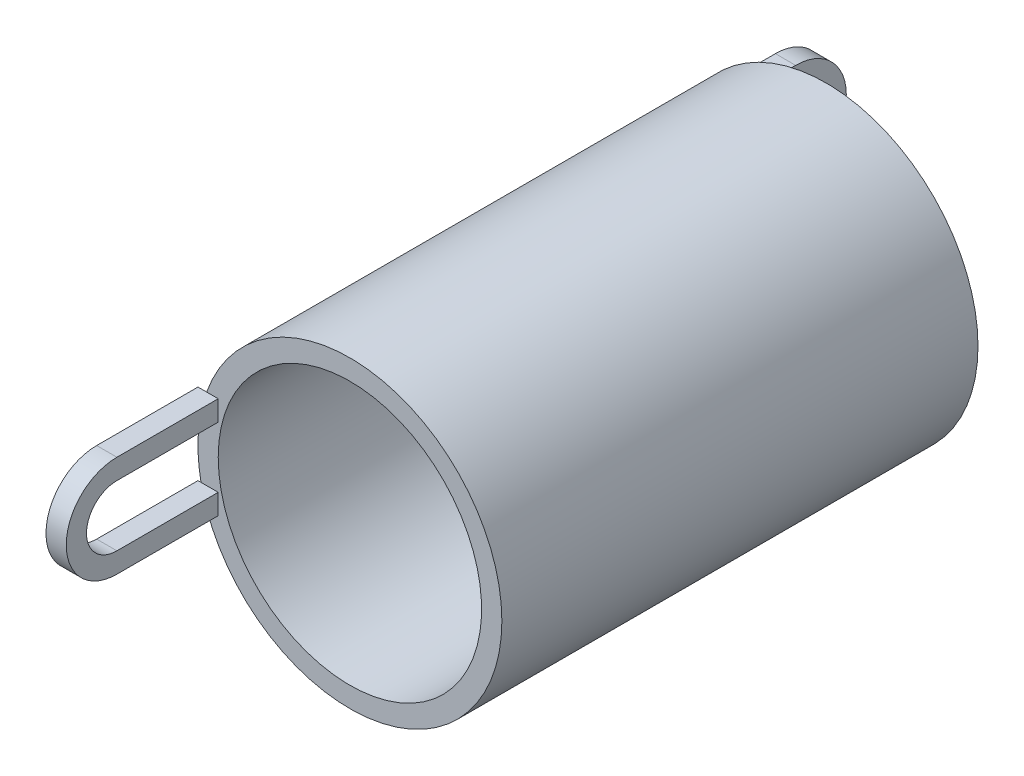
ISO-10303-21;
HEADER;
FILE_DESCRIPTION(('STEP AP214'),'2;1');
FILE_NAME('part.step','',(''),(''),'','','');
FILE_SCHEMA(('AUTOMOTIVE_DESIGN { 1 0 10303 214 1 1 1 1 }'));
ENDSEC;
DATA;
#1=APPLICATION_CONTEXT('core data for automotive mechanical design processes');
#2=APPLICATION_PROTOCOL_DEFINITION('international standard','automotive_design',2000,#1);
#3=PRODUCT_CONTEXT('',#1,'mechanical');
#4=PRODUCT('Part','Part','',(#3));
#5=PRODUCT_RELATED_PRODUCT_CATEGORY('part','',(#4));
#6=PRODUCT_DEFINITION_FORMATION('','',#4);
#7=PRODUCT_DEFINITION_CONTEXT('part definition',#1,'design');
#8=PRODUCT_DEFINITION('design','',#6,#7);
#9=PRODUCT_DEFINITION_SHAPE('','',#8);
#10=(LENGTH_UNIT() NAMED_UNIT(*) SI_UNIT(.MILLI.,.METRE.));
#11=(NAMED_UNIT(*) PLANE_ANGLE_UNIT() SI_UNIT($,.RADIAN.));
#12=(NAMED_UNIT(*) SI_UNIT($,.STERADIAN.) SOLID_ANGLE_UNIT());
#13=UNCERTAINTY_MEASURE_WITH_UNIT(LENGTH_MEASURE(1.E-05),#10,'distance_accuracy_value','');
#14=(GEOMETRIC_REPRESENTATION_CONTEXT(3) GLOBAL_UNCERTAINTY_ASSIGNED_CONTEXT((#13)) GLOBAL_UNIT_ASSIGNED_CONTEXT((#10,
#11,#12)) REPRESENTATION_CONTEXT('',''));
#15=CARTESIAN_POINT('',(0.,0.,0.));
#16=DIRECTION('',(0.,0.,1.));
#17=DIRECTION('',(1.,0.,0.));
#18=AXIS2_PLACEMENT_3D('',#15,#16,#17);
#19=CARTESIAN_POINT('',(-1.66533453693773E-13,0.,23.5));
#20=DIRECTION('',(0.,0.,0.999999999999999));
#21=DIRECTION('',(1.,0.,0.));
#22=AXIS2_PLACEMENT_3D('',#19,#20,#21);
#23=PLANE('',#22);
#24=CARTESIAN_POINT('',(-1.66533453693773E-13,0.,23.5));
#25=DIRECTION('',(0.,0.,0.999999999999999));
#26=DIRECTION('',(1.,0.,0.));
#27=AXIS2_PLACEMENT_3D('',#24,#25,#26);
#28=CIRCLE('',#27,6.5);
#29=CARTESIAN_POINT('',(-6.50000000000017,0.,23.5));
#30=VERTEX_POINT('',#29);
#31=EDGE_CURVE('E305',#30,#30,#28,.T.);
#32=ORIENTED_EDGE('',*,*,#31,.F.);
#33=EDGE_LOOP('',(#32));
#34=FACE_BOUND('',#33,.T.);
#35=DIRECTION('',(0.,0.999999999999999,0.));
#36=VECTOR('',#35,1.);
#37=CARTESIAN_POINT('',(-6.50000000000006,1.50000000000003,23.5));
#38=LINE('',#37,#36);
#39=CARTESIAN_POINT('',(-6.50000000000006,1.50000000000003,23.5));
#40=VERTEX_POINT('',#39);
#41=CARTESIAN_POINT('',(-6.50000000000009,2.50000000000001,23.5));
#42=VERTEX_POINT('',#41);
#43=EDGE_CURVE('E57',#40,#42,#38,.T.);
#44=ORIENTED_EDGE('',*,*,#43,.F.);
#45=DIRECTION('',(-1.,0.,0.));
#46=VECTOR('',#45,1.);
#47=CARTESIAN_POINT('',(-6.50000000000006,1.50000000000003,23.5));
#48=LINE('',#47,#46);
#49=CARTESIAN_POINT('',(-7.34846922834961,1.50000000000002,23.5));
#50=VERTEX_POINT('',#49);
#51=EDGE_CURVE('E581',#40,#50,#48,.T.);
#52=ORIENTED_EDGE('',*,*,#51,.T.);
#53=CARTESIAN_POINT('',(-1.66533453693773E-13,0.,23.5));
#54=DIRECTION('',(0.,0.,0.999999999999999));
#55=DIRECTION('',(1.,0.,0.));
#56=AXIS2_PLACEMENT_3D('',#53,#54,#55);
#57=CIRCLE('',#56,7.5);
#58=CARTESIAN_POINT('',(-7.34846922834961,-1.49999999999999,23.5));
#59=VERTEX_POINT('',#58);
#60=EDGE_CURVE('E49',#50,#59,#57,.T.);
#61=ORIENTED_EDGE('',*,*,#60,.T.);
#62=DIRECTION('',(-1.,0.,0.));
#63=VECTOR('',#62,1.);
#64=CARTESIAN_POINT('',(-6.50000000000006,-1.49999999999998,23.5));
#65=LINE('',#64,#63);
#66=CARTESIAN_POINT('',(-6.50000000000006,-1.49999999999998,23.5));
#67=VERTEX_POINT('',#66);
#68=EDGE_CURVE('E592',#67,#59,#65,.T.);
#69=ORIENTED_EDGE('',*,*,#68,.F.);
#70=DIRECTION('',(0.,0.999999999999999,0.));
#71=VECTOR('',#70,1.);
#72=CARTESIAN_POINT('',(-6.50000000000006,-2.49999999999998,23.5));
#73=LINE('',#72,#71);
#74=CARTESIAN_POINT('',(-6.50000000000006,-2.49999999999998,23.5));
#75=VERTEX_POINT('',#74);
#76=EDGE_CURVE('E192',#75,#67,#73,.T.);
#77=ORIENTED_EDGE('',*,*,#76,.F.);
#78=DIRECTION('',(-1.,0.,0.));
#79=VECTOR('',#78,1.);
#80=CARTESIAN_POINT('',(-6.50000000000006,-2.49999999999998,23.5));
#81=LINE('',#80,#79);
#82=CARTESIAN_POINT('',(-7.07106781186553,-2.49999999999998,23.5));
#83=VERTEX_POINT('',#82);
#84=EDGE_CURVE('E188',#75,#83,#81,.T.);
#85=ORIENTED_EDGE('',*,*,#84,.T.);
#86=CARTESIAN_POINT('',(-7.07106781186556,2.50000000000002,23.5));
#87=VERTEX_POINT('',#86);
#88=EDGE_CURVE('E50',#83,#87,#57,.T.);
#89=ORIENTED_EDGE('',*,*,#88,.T.);
#90=DIRECTION('',(-1.,0.,0.));
#91=VECTOR('',#90,1.);
#92=CARTESIAN_POINT('',(-6.50000000000009,2.50000000000001,23.5));
#93=LINE('',#92,#91);
#94=EDGE_CURVE('E62',#42,#87,#93,.T.);
#95=ORIENTED_EDGE('',*,*,#94,.F.);
#96=EDGE_LOOP('',(#44,#52,#61,#69,#77,#85,#89,#95));
#97=FACE_BOUND('',#96,.T.);
#98=ADVANCED_FACE('F39',(#34,#97),#23,.T.);
#99=CARTESIAN_POINT('',(0.,0.,0.));
#100=DIRECTION('',(0.,0.,0.999999999999999));
#101=DIRECTION('',(1.,0.,0.));
#102=AXIS2_PLACEMENT_3D('',#99,#100,#101);
#103=PLANE('',#102);
#104=CARTESIAN_POINT('',(0.,0.,0.));
#105=DIRECTION('',(0.,0.,0.999999999999999));
#106=DIRECTION('',(1.,0.,0.));
#107=AXIS2_PLACEMENT_3D('',#104,#105,#106);
#108=CIRCLE('',#107,6.5);
#109=CARTESIAN_POINT('',(-6.50000000000017,0.,0.));
#110=VERTEX_POINT('',#109);
#111=EDGE_CURVE('E304',#110,#110,#108,.T.);
#112=ORIENTED_EDGE('',*,*,#111,.T.);
#113=EDGE_LOOP('',(#112));
#114=FACE_BOUND('',#113,.T.);
#115=DIRECTION('',(-1.,0.,0.));
#116=VECTOR('',#115,1.);
#117=CARTESIAN_POINT('',(-6.50000000000009,-1.5,0.));
#118=LINE('',#117,#116);
#119=CARTESIAN_POINT('',(-6.50000000000009,-1.5,0.));
#120=VERTEX_POINT('',#119);
#121=CARTESIAN_POINT('',(-7.34846922834961,-1.5,0.));
#122=VERTEX_POINT('',#121);
#123=EDGE_CURVE('E296',#120,#122,#118,.T.);
#124=ORIENTED_EDGE('',*,*,#123,.T.);
#125=CARTESIAN_POINT('',(0.,0.,0.));
#126=DIRECTION('',(0.,0.,0.999999999999999));
#127=DIRECTION('',(1.,0.,0.));
#128=AXIS2_PLACEMENT_3D('',#125,#126,#127);
#129=CIRCLE('',#128,7.5);
#130=CARTESIAN_POINT('',(-7.34846922834961,1.50000000000001,0.));
#131=VERTEX_POINT('',#130);
#132=EDGE_CURVE('E636',#131,#122,#129,.T.);
#133=ORIENTED_EDGE('',*,*,#132,.F.);
#134=DIRECTION('',(-1.,0.,0.));
#135=VECTOR('',#134,1.);
#136=CARTESIAN_POINT('',(-6.50000000000009,1.50000000000001,0.));
#137=LINE('',#136,#135);
#138=CARTESIAN_POINT('',(-6.50000000000009,1.50000000000001,0.));
#139=VERTEX_POINT('',#138);
#140=EDGE_CURVE('E275',#139,#131,#137,.T.);
#141=ORIENTED_EDGE('',*,*,#140,.F.);
#142=DIRECTION('',(0.,-1.,0.));
#143=VECTOR('',#142,1.);
#144=CARTESIAN_POINT('',(-6.50000000000009,2.50000000000003,0.));
#145=LINE('',#144,#143);
#146=CARTESIAN_POINT('',(-6.50000000000009,2.50000000000003,0.));
#147=VERTEX_POINT('',#146);
#148=EDGE_CURVE('E241',#147,#139,#145,.T.);
#149=ORIENTED_EDGE('',*,*,#148,.F.);
#150=DIRECTION('',(-1.,0.,0.));
#151=VECTOR('',#150,1.);
#152=CARTESIAN_POINT('',(-6.50000000000009,2.50000000000003,0.));
#153=LINE('',#152,#151);
#154=CARTESIAN_POINT('',(-7.07106781186556,2.50000000000003,0.));
#155=VERTEX_POINT('',#154);
#156=EDGE_CURVE('E279',#147,#155,#153,.T.);
#157=ORIENTED_EDGE('',*,*,#156,.T.);
#158=CARTESIAN_POINT('',(-7.07106781186556,-2.5,0.));
#159=VERTEX_POINT('',#158);
#160=EDGE_CURVE('E309',#159,#155,#129,.T.);
#161=ORIENTED_EDGE('',*,*,#160,.F.);
#162=DIRECTION('',(-1.,0.,0.));
#163=VECTOR('',#162,1.);
#164=CARTESIAN_POINT('',(-6.50000000000009,-2.5,0.));
#165=LINE('',#164,#163);
#166=CARTESIAN_POINT('',(-6.50000000000009,-2.5,0.));
#167=VERTEX_POINT('',#166);
#168=EDGE_CURVE('E292',#167,#159,#165,.T.);
#169=ORIENTED_EDGE('',*,*,#168,.F.);
#170=DIRECTION('',(0.,-0.999999999999999,0.));
#171=VECTOR('',#170,1.);
#172=CARTESIAN_POINT('',(-6.50000000000009,-2.5,0.));
#173=LINE('',#172,#171);
#174=EDGE_CURVE('E229',#120,#167,#173,.T.);
#175=ORIENTED_EDGE('',*,*,#174,.F.);
#176=EDGE_LOOP('',(#124,#133,#141,#149,#157,#161,#169,#175));
#177=FACE_BOUND('',#176,.T.);
#178=ADVANCED_FACE('F315',(#114,#177),#103,.F.);
#179=CARTESIAN_POINT('',(-1.66533453693773E-13,0.,23.5));
#180=DIRECTION('',(0.,0.,-0.999999999999999));
#181=DIRECTION('',(-1.,0.,0.));
#182=AXIS2_PLACEMENT_3D('',#179,#180,#181);
#183=CYLINDRICAL_SURFACE('',#182,7.5);
#184=EDGE_CURVE('E11',#87,#50,#57,.T.);
#185=ORIENTED_EDGE('',*,*,#184,.F.);
#186=ORIENTED_EDGE('',*,*,#88,.F.);
#187=EDGE_CURVE('E628',#59,#83,#57,.T.);
#188=ORIENTED_EDGE('',*,*,#187,.F.);
#189=ORIENTED_EDGE('',*,*,#60,.F.);
#190=EDGE_LOOP('',(#185,#186,#188,#189));
#191=FACE_BOUND('',#190,.T.);
#192=EDGE_CURVE('E43',#155,#131,#129,.T.);
#193=ORIENTED_EDGE('',*,*,#192,.T.);
#194=ORIENTED_EDGE('',*,*,#132,.T.);
#195=EDGE_CURVE('E642',#122,#159,#129,.T.);
#196=ORIENTED_EDGE('',*,*,#195,.T.);
#197=ORIENTED_EDGE('',*,*,#160,.T.);
#198=EDGE_LOOP('',(#193,#194,#196,#197));
#199=FACE_BOUND('',#198,.T.);
#200=ADVANCED_FACE('F41',(#191,#199),#183,.T.);
#201=CARTESIAN_POINT('',(-1.66533453693773E-13,0.,23.5));
#202=DIRECTION('',(0.,0.,-0.999999999999999));
#203=DIRECTION('',(-1.,0.,0.));
#204=AXIS2_PLACEMENT_3D('',#201,#202,#203);
#205=CYLINDRICAL_SURFACE('',#204,6.5);
#206=CARTESIAN_POINT('',(-6.50000000000017,0.,23.5));
#207=CARTESIAN_POINT('',(-6.50000000000017,0.,23.2552083333333));
#208=CARTESIAN_POINT('',(-6.50000000000017,0.,23.0104166666666));
#209=CARTESIAN_POINT('',(-6.50000000000017,0.,22.5208333333333));
#210=CARTESIAN_POINT('',(-6.50000000000017,0.,22.2760416666666));
#211=CARTESIAN_POINT('',(-6.50000000000017,0.,21.7864583333333));
#212=CARTESIAN_POINT('',(-6.50000000000017,0.,21.5416666666666));
#213=CARTESIAN_POINT('',(-6.50000000000017,0.,21.0520833333333));
#214=CARTESIAN_POINT('',(-6.50000000000017,0.,20.8072916666666));
#215=CARTESIAN_POINT('',(-6.50000000000017,0.,20.3177083333333));
#216=CARTESIAN_POINT('',(-6.50000000000017,0.,20.0729166666666));
#217=CARTESIAN_POINT('',(-6.50000000000017,0.,19.5833333333333));
#218=CARTESIAN_POINT('',(-6.50000000000017,0.,19.3385416666666));
#219=CARTESIAN_POINT('',(-6.50000000000017,0.,18.8489583333333));
#220=CARTESIAN_POINT('',(-6.50000000000017,0.,18.6041666666666));
#221=CARTESIAN_POINT('',(-6.50000000000017,0.,18.1145833333333));
#222=CARTESIAN_POINT('',(-6.50000000000017,0.,17.8697916666667));
#223=CARTESIAN_POINT('',(-6.50000000000017,0.,17.3802083333333));
#224=CARTESIAN_POINT('',(-6.50000000000017,0.,17.1354166666666));
#225=CARTESIAN_POINT('',(-6.50000000000017,0.,16.6458333333333));
#226=CARTESIAN_POINT('',(-6.50000000000017,0.,16.4010416666666));
#227=CARTESIAN_POINT('',(-6.50000000000017,0.,15.9114583333333));
#228=CARTESIAN_POINT('',(-6.50000000000017,0.,15.6666666666666));
#229=CARTESIAN_POINT('',(-6.50000000000017,0.,15.1770833333333));
#230=CARTESIAN_POINT('',(-6.50000000000017,0.,14.9322916666667));
#231=CARTESIAN_POINT('',(-6.50000000000017,0.,14.4427083333333));
#232=CARTESIAN_POINT('',(-6.50000000000017,0.,14.1979166666667));
#233=CARTESIAN_POINT('',(-6.50000000000017,0.,13.7083333333333));
#234=CARTESIAN_POINT('',(-6.50000000000017,0.,13.4635416666667));
#235=CARTESIAN_POINT('',(-6.50000000000017,0.,12.9739583333333));
#236=CARTESIAN_POINT('',(-6.50000000000017,0.,12.7291666666667));
#237=CARTESIAN_POINT('',(-6.50000000000017,0.,12.2395833333333));
#238=CARTESIAN_POINT('',(-6.50000000000017,0.,11.9947916666667));
#239=CARTESIAN_POINT('',(-6.50000000000017,0.,11.5052083333333));
#240=CARTESIAN_POINT('',(-6.50000000000017,0.,11.2604166666667));
#241=CARTESIAN_POINT('',(-6.50000000000017,0.,10.7708333333333));
#242=CARTESIAN_POINT('',(-6.50000000000017,0.,10.5260416666667));
#243=CARTESIAN_POINT('',(-6.50000000000017,0.,10.0364583333333));
#244=CARTESIAN_POINT('',(-6.50000000000017,0.,9.79166666666665));
#245=CARTESIAN_POINT('',(-6.50000000000017,0.,9.30208333333332));
#246=CARTESIAN_POINT('',(-6.50000000000017,0.,9.05729166666665));
#247=CARTESIAN_POINT('',(-6.50000000000017,0.,8.56770833333332));
#248=CARTESIAN_POINT('',(-6.50000000000017,0.,8.32291666666666));
#249=CARTESIAN_POINT('',(-6.50000000000017,0.,7.83333333333332));
#250=CARTESIAN_POINT('',(-6.50000000000017,0.,7.58854166666666));
#251=CARTESIAN_POINT('',(-6.50000000000017,0.,7.09895833333333));
#252=CARTESIAN_POINT('',(-6.50000000000017,0.,6.85416666666666));
#253=CARTESIAN_POINT('',(-6.50000000000017,0.,6.36458333333333));
#254=CARTESIAN_POINT('',(-6.50000000000017,0.,6.11979166666666));
#255=CARTESIAN_POINT('',(-6.50000000000017,0.,5.63020833333333));
#256=CARTESIAN_POINT('',(-6.50000000000017,0.,5.38541666666666));
#257=CARTESIAN_POINT('',(-6.50000000000017,0.,4.89583333333333));
#258=CARTESIAN_POINT('',(-6.50000000000017,0.,4.65104166666666));
#259=CARTESIAN_POINT('',(-6.50000000000017,0.,4.16145833333333));
#260=CARTESIAN_POINT('',(-6.50000000000017,0.,3.91666666666666));
#261=CARTESIAN_POINT('',(-6.50000000000017,0.,3.42708333333333));
#262=CARTESIAN_POINT('',(-6.50000000000017,0.,3.18229166666666));
#263=CARTESIAN_POINT('',(-6.50000000000017,0.,2.69270833333333));
#264=CARTESIAN_POINT('',(-6.50000000000017,0.,2.44791666666666));
#265=CARTESIAN_POINT('',(-6.50000000000017,0.,1.95833333333333));
#266=CARTESIAN_POINT('',(-6.50000000000017,0.,1.71354166666666));
#267=CARTESIAN_POINT('',(-6.50000000000017,0.,1.22395833333333));
#268=CARTESIAN_POINT('',(-6.50000000000017,0.,0.979166666666665));
#269=CARTESIAN_POINT('',(-6.50000000000017,0.,0.489583333333333));
#270=CARTESIAN_POINT('',(-6.50000000000017,0.,0.244791666666666));
#271=CARTESIAN_POINT('',(-6.50000000000017,0.,0.));
#272=B_SPLINE_CURVE_WITH_KNOTS('',3,(#206,#207,#208,#209,#210,#211,#212,#213,#214,#215,#216,
#217,#218,#219,#220,#221,#222,#223,#224,#225,#226,#227,#228,#229,#230,#231,#232,#233,#234,#235,
#236,#237,#238,#239,#240,#241,#242,#243,#244,#245,#246,#247,#248,#249,#250,#251,#252,#253,#254,
#255,#256,#257,#258,#259,#260,#261,#262,#263,#264,#265,#266,#267,#268,#269,#270,#271),
.UNSPECIFIED.,.F.,.F.,(4,2,2,2,2,2,2,2,2,2,2,2,2,2,2,2,2,2,2,2,2,2,2,2,2,2,2,2,2,2,2,2,4),(0.,
0.734375000000002,1.46875,2.203125,2.9375,3.671875,4.40625,5.140625,5.87499999999999,6.609375,
7.34374999999999,8.07812499999999,8.81249999999999,9.54687499999999,10.28125,11.015625,11.75,
12.484375,13.21875,13.953125,14.6875,15.421875,16.15625,16.890625,17.625,18.359375,19.09375,
19.828125,20.5625,21.296875,22.03125,22.765625,23.5),.UNSPECIFIED.);
#273=EDGE_CURVE('BSEAM318',#30,#110,#272,.T.);
#274=ORIENTED_EDGE('',*,*,#31,.T.);
#275=ORIENTED_EDGE('',*,*,#111,.F.);
#276=ORIENTED_EDGE('',*,*,#273,.T.);
#277=ORIENTED_EDGE('',*,*,#273,.F.);
#278=EDGE_LOOP('',(#274,#276,#275,#277));
#279=FACE_BOUND('',#278,.T.);
#280=ADVANCED_FACE('F318',(#279),#205,.F.);
#281=CARTESIAN_POINT('',(-6.50000000000006,0.,-4.99999999999996));
#282=DIRECTION('',(-1.,0.,0.));
#283=DIRECTION('',(0.,0.,0.999999999999999));
#284=AXIS2_PLACEMENT_3D('',#281,#282,#283);
#285=CYLINDRICAL_SURFACE('',#284,1.5);
#286=CARTESIAN_POINT('',(-7.50000000000006,0.,-4.99999999999998));
#287=DIRECTION('',(-1.,0.,0.));
#288=DIRECTION('',(0.,0.,-0.999999999999999));
#289=AXIS2_PLACEMENT_3D('',#286,#287,#288);
#290=CIRCLE('',#289,1.5);
#291=CARTESIAN_POINT('',(-7.50000000000006,1.50000000000002,-4.99999999999999));
#292=VERTEX_POINT('',#291);
#293=CARTESIAN_POINT('',(-7.50000000000006,-1.49999999999998,-5.));
#294=VERTEX_POINT('',#293);
#295=EDGE_CURVE('E209',#292,#294,#290,.T.);
#296=ORIENTED_EDGE('',*,*,#295,.T.);
#297=DIRECTION('',(-1.,0.,0.));
#298=VECTOR('',#297,1.);
#299=CARTESIAN_POINT('',(-6.50000000000006,-1.49999999999997,-4.99999999999998));
#300=LINE('',#299,#298);
#301=CARTESIAN_POINT('',(-6.50000000000006,-1.49999999999997,-4.99999999999998));
#302=VERTEX_POINT('',#301);
#303=EDGE_CURVE('E300',#302,#294,#300,.T.);
#304=ORIENTED_EDGE('',*,*,#303,.F.);
#305=CARTESIAN_POINT('',(-6.50000000000006,0.,-4.99999999999996));
#306=DIRECTION('',(-1.,0.,0.));
#307=DIRECTION('',(0.,0.,-0.999999999999999));
#308=AXIS2_PLACEMENT_3D('',#305,#306,#307);
#309=CIRCLE('',#308,1.5);
#310=CARTESIAN_POINT('',(-6.50000000000006,1.5,-4.99999999999999));
#311=VERTEX_POINT('',#310);
#312=EDGE_CURVE('E221',#311,#302,#309,.T.);
#313=ORIENTED_EDGE('',*,*,#312,.F.);
#314=DIRECTION('',(-1.,0.,0.));
#315=VECTOR('',#314,1.);
#316=CARTESIAN_POINT('',(-6.50000000000006,1.5,-4.99999999999999));
#317=LINE('',#316,#315);
#318=EDGE_CURVE('E246',#311,#292,#317,.T.);
#319=ORIENTED_EDGE('',*,*,#318,.T.);
#320=EDGE_LOOP('',(#296,#304,#313,#319));
#321=FACE_BOUND('',#320,.T.);
#322=ADVANCED_FACE('F320',(#321),#285,.F.);
#323=CARTESIAN_POINT('',(-6.50000000000006,-1.49999999999997,-4.99999999999998));
#324=DIRECTION('',(0.,-0.999999999999999,0.));
#325=DIRECTION('',(0.,0.,-0.999999999999999));
#326=AXIS2_PLACEMENT_3D('',#323,#324,#325);
#327=PLANE('',#326);
#328=DIRECTION('',(0.,0.,0.999999999999999));
#329=VECTOR('',#328,1.);
#330=CARTESIAN_POINT('',(-7.50000000000006,-1.49999999999998,-5.));
#331=LINE('',#330,#329);
#332=CARTESIAN_POINT('',(-7.50000000000009,-1.49999999999999,0.));
#333=VERTEX_POINT('',#332);
#334=EDGE_CURVE('E215',#294,#333,#331,.T.);
#335=ORIENTED_EDGE('',*,*,#334,.T.);
#336=EDGE_CURVE('E295',#122,#333,#118,.T.);
#337=ORIENTED_EDGE('',*,*,#336,.F.);
#338=ORIENTED_EDGE('',*,*,#123,.F.);
#339=DIRECTION('',(0.,0.,0.999999999999999));
#340=VECTOR('',#339,1.);
#341=CARTESIAN_POINT('',(-6.50000000000006,-1.49999999999997,-4.99999999999998));
#342=LINE('',#341,#340);
#343=EDGE_CURVE('E225',#302,#120,#342,.T.);
#344=ORIENTED_EDGE('',*,*,#343,.F.);
#345=ORIENTED_EDGE('',*,*,#303,.T.);
#346=EDGE_LOOP('',(#335,#337,#338,#344,#345));
#347=FACE_BOUND('',#346,.T.);
#348=ADVANCED_FACE('F327',(#347),#327,.F.);
#349=CARTESIAN_POINT('',(-6.50000000000009,-2.5,0.));
#350=DIRECTION('',(0.,0.,-0.999999999999999));
#351=DIRECTION('',(0.,0.999999999999999,0.));
#352=AXIS2_PLACEMENT_3D('',#349,#350,#351);
#353=PLANE('',#352);
#354=CARTESIAN_POINT('',(-7.50000000000009,-2.49999999999999,0.));
#355=VERTEX_POINT('',#354);
#356=EDGE_CURVE('E291',#159,#355,#165,.T.);
#357=ORIENTED_EDGE('',*,*,#356,.F.);
#358=ORIENTED_EDGE('',*,*,#195,.F.);
#359=ORIENTED_EDGE('',*,*,#336,.T.);
#360=DIRECTION('',(0.,-0.999999999999999,0.));
#361=VECTOR('',#360,1.);
#362=CARTESIAN_POINT('',(-7.50000000000009,-2.49999999999999,0.));
#363=LINE('',#362,#361);
#364=EDGE_CURVE('E251',#333,#355,#363,.T.);
#365=ORIENTED_EDGE('',*,*,#364,.T.);
#366=EDGE_LOOP('',(#357,#358,#359,#365));
#367=FACE_BOUND('',#366,.T.);
#368=ADVANCED_FACE('F364',(#367),#353,.F.);
#369=CARTESIAN_POINT('',(-6.50000000000006,-2.49999999999998,-5.));
#370=DIRECTION('',(0.,0.999999999999999,0.));
#371=DIRECTION('',(0.,0.,0.999999999999999));
#372=AXIS2_PLACEMENT_3D('',#369,#370,#371);
#373=PLANE('',#372);
#374=DIRECTION('',(0.,0.,-0.999999999999999));
#375=VECTOR('',#374,1.);
#376=CARTESIAN_POINT('',(-7.50000000000006,-2.49999999999996,-5.00000000000002));
#377=LINE('',#376,#375);
#378=CARTESIAN_POINT('',(-7.50000000000006,-2.49999999999996,-5.00000000000002));
#379=VERTEX_POINT('',#378);
#380=EDGE_CURVE('E255',#355,#379,#377,.T.);
#381=ORIENTED_EDGE('',*,*,#380,.T.);
#382=DIRECTION('',(-1.,0.,0.));
#383=VECTOR('',#382,1.);
#384=CARTESIAN_POINT('',(-6.50000000000006,-2.49999999999998,-5.));
#385=LINE('',#384,#383);
#386=CARTESIAN_POINT('',(-6.50000000000006,-2.49999999999998,-5.));
#387=VERTEX_POINT('',#386);
#388=EDGE_CURVE('E287',#387,#379,#385,.T.);
#389=ORIENTED_EDGE('',*,*,#388,.F.);
#390=DIRECTION('',(0.,0.,-0.999999999999999));
#391=VECTOR('',#390,1.);
#392=CARTESIAN_POINT('',(-6.50000000000006,-2.49999999999998,-5.));
#393=LINE('',#392,#391);
#394=EDGE_CURVE('E232',#167,#387,#393,.T.);
#395=ORIENTED_EDGE('',*,*,#394,.F.);
#396=ORIENTED_EDGE('',*,*,#168,.T.);
#397=ORIENTED_EDGE('',*,*,#356,.T.);
#398=EDGE_LOOP('',(#381,#389,#395,#396,#397));
#399=FACE_BOUND('',#398,.T.);
#400=ADVANCED_FACE('F374',(#399),#373,.F.);
#401=CARTESIAN_POINT('',(-6.50000000000006,0.,-4.99999999999996));
#402=DIRECTION('',(-1.,0.,0.));
#403=DIRECTION('',(0.,0.,0.999999999999999));
#404=AXIS2_PLACEMENT_3D('',#401,#402,#403);
#405=CYLINDRICAL_SURFACE('',#404,2.5);
#406=CARTESIAN_POINT('',(-7.50000000000006,0.,-4.99999999999998));
#407=DIRECTION('',(1.,0.,0.));
#408=DIRECTION('',(0.,0.,-0.999999999999999));
#409=AXIS2_PLACEMENT_3D('',#406,#407,#408);
#410=CIRCLE('',#409,2.5);
#411=CARTESIAN_POINT('',(-7.50000000000006,2.5,-5.));
#412=VERTEX_POINT('',#411);
#413=EDGE_CURVE('E258',#379,#412,#410,.T.);
#414=ORIENTED_EDGE('',*,*,#413,.T.);
#415=DIRECTION('',(-1.,0.,0.));
#416=VECTOR('',#415,1.);
#417=CARTESIAN_POINT('',(-6.50000000000009,2.5,-5.));
#418=LINE('',#417,#416);
#419=CARTESIAN_POINT('',(-6.50000000000009,2.5,-5.));
#420=VERTEX_POINT('',#419);
#421=EDGE_CURVE('E283',#420,#412,#418,.T.);
#422=ORIENTED_EDGE('',*,*,#421,.F.);
#423=CARTESIAN_POINT('',(-6.50000000000006,0.,-4.99999999999996));
#424=DIRECTION('',(1.,0.,0.));
#425=DIRECTION('',(0.,0.,-0.999999999999999));
#426=AXIS2_PLACEMENT_3D('',#423,#424,#425);
#427=CIRCLE('',#426,2.5);
#428=EDGE_CURVE('E235',#387,#420,#427,.T.);
#429=ORIENTED_EDGE('',*,*,#428,.F.);
#430=ORIENTED_EDGE('',*,*,#388,.T.);
#431=EDGE_LOOP('',(#414,#422,#429,#430));
#432=FACE_BOUND('',#431,.T.);
#433=ADVANCED_FACE('F384',(#432),#405,.T.);
#434=CARTESIAN_POINT('',(-6.50000000000009,2.5,-5.));
#435=DIRECTION('',(0.,-0.999999999999999,0.));
#436=DIRECTION('',(0.,0.,-0.999999999999999));
#437=AXIS2_PLACEMENT_3D('',#434,#435,#436);
#438=PLANE('',#437);
#439=DIRECTION('',(0.,0.,0.999999999999999));
#440=VECTOR('',#439,1.);
#441=CARTESIAN_POINT('',(-7.50000000000006,2.5,-5.));
#442=LINE('',#441,#440);
#443=CARTESIAN_POINT('',(-7.50000000000009,2.50000000000002,0.));
#444=VERTEX_POINT('',#443);
#445=EDGE_CURVE('E261',#412,#444,#442,.T.);
#446=ORIENTED_EDGE('',*,*,#445,.T.);
#447=EDGE_CURVE('E278',#155,#444,#153,.T.);
#448=ORIENTED_EDGE('',*,*,#447,.F.);
#449=ORIENTED_EDGE('',*,*,#156,.F.);
#450=DIRECTION('',(0.,0.,0.999999999999999));
#451=VECTOR('',#450,1.);
#452=CARTESIAN_POINT('',(-6.50000000000009,2.5,-5.));
#453=LINE('',#452,#451);
#454=EDGE_CURVE('E238',#420,#147,#453,.T.);
#455=ORIENTED_EDGE('',*,*,#454,.F.);
#456=ORIENTED_EDGE('',*,*,#421,.T.);
#457=EDGE_LOOP('',(#446,#448,#449,#455,#456));
#458=FACE_BOUND('',#457,.T.);
#459=ADVANCED_FACE('F394',(#458),#438,.F.);
#460=CARTESIAN_POINT('',(-6.50000000000009,2.50000000000003,0.));
#461=DIRECTION('',(0.,0.,-1.));
#462=DIRECTION('',(0.,1.,0.));
#463=AXIS2_PLACEMENT_3D('',#460,#461,#462);
#464=PLANE('',#463);
#465=CARTESIAN_POINT('',(-7.50000000000009,1.50000000000001,0.));
#466=VERTEX_POINT('',#465);
#467=EDGE_CURVE('E274',#131,#466,#137,.T.);
#468=ORIENTED_EDGE('',*,*,#467,.F.);
#469=ORIENTED_EDGE('',*,*,#192,.F.);
#470=ORIENTED_EDGE('',*,*,#447,.T.);
#471=DIRECTION('',(0.,-1.,0.));
#472=VECTOR('',#471,1.);
#473=CARTESIAN_POINT('',(-7.50000000000009,2.50000000000002,0.));
#474=LINE('',#473,#472);
#475=EDGE_CURVE('E265',#444,#466,#474,.T.);
#476=ORIENTED_EDGE('',*,*,#475,.T.);
#477=EDGE_LOOP('',(#468,#469,#470,#476));
#478=FACE_BOUND('',#477,.T.);
#479=ADVANCED_FACE('F404',(#478),#464,.F.);
#480=CARTESIAN_POINT('',(-6.50000000000006,1.5,-4.99999999999999));
#481=DIRECTION('',(0.,0.999999999999999,0.));
#482=DIRECTION('',(0.,0.,0.999999999999999));
#483=AXIS2_PLACEMENT_3D('',#480,#481,#482);
#484=PLANE('',#483);
#485=DIRECTION('',(0.,0.,-0.999999999999999));
#486=VECTOR('',#485,1.);
#487=CARTESIAN_POINT('',(-7.50000000000006,1.50000000000002,-4.99999999999999));
#488=LINE('',#487,#486);
#489=EDGE_CURVE('E226',#466,#292,#488,.T.);
#490=ORIENTED_EDGE('',*,*,#489,.T.);
#491=ORIENTED_EDGE('',*,*,#318,.F.);
#492=DIRECTION('',(0.,0.,-0.999999999999999));
#493=VECTOR('',#492,1.);
#494=CARTESIAN_POINT('',(-6.50000000000006,1.5,-4.99999999999999));
#495=LINE('',#494,#493);
#496=EDGE_CURVE('E244',#139,#311,#495,.T.);
#497=ORIENTED_EDGE('',*,*,#496,.F.);
#498=ORIENTED_EDGE('',*,*,#140,.T.);
#499=ORIENTED_EDGE('',*,*,#467,.T.);
#500=EDGE_LOOP('',(#490,#491,#497,#498,#499));
#501=FACE_BOUND('',#500,.T.);
#502=ADVANCED_FACE('F414',(#501),#484,.F.);
#503=CARTESIAN_POINT('',(-6.50000000000006,0.,-4.99999999999996));
#504=DIRECTION('',(1.,0.,0.));
#505=DIRECTION('',(0.,0.,-0.999999999999999));
#506=AXIS2_PLACEMENT_3D('',#503,#504,#505);
#507=PLANE('',#506);
#508=ORIENTED_EDGE('',*,*,#312,.T.);
#509=ORIENTED_EDGE('',*,*,#343,.T.);
#510=ORIENTED_EDGE('',*,*,#174,.T.);
#511=ORIENTED_EDGE('',*,*,#394,.T.);
#512=ORIENTED_EDGE('',*,*,#428,.T.);
#513=ORIENTED_EDGE('',*,*,#454,.T.);
#514=ORIENTED_EDGE('',*,*,#148,.T.);
#515=ORIENTED_EDGE('',*,*,#496,.T.);
#516=EDGE_LOOP('',(#508,#509,#510,#511,#512,#513,#514,#515));
#517=FACE_BOUND('',#516,.T.);
#518=ADVANCED_FACE('F424',(#517),#507,.T.);
#519=CARTESIAN_POINT('',(-7.50000000000006,0.,-4.99999999999998));
#520=DIRECTION('',(1.,0.,0.));
#521=DIRECTION('',(0.,0.,-0.999999999999999));
#522=AXIS2_PLACEMENT_3D('',#519,#520,#521);
#523=PLANE('',#522);
#524=ORIENTED_EDGE('',*,*,#295,.F.);
#525=ORIENTED_EDGE('',*,*,#489,.F.);
#526=ORIENTED_EDGE('',*,*,#475,.F.);
#527=ORIENTED_EDGE('',*,*,#445,.F.);
#528=ORIENTED_EDGE('',*,*,#413,.F.);
#529=ORIENTED_EDGE('',*,*,#380,.F.);
#530=ORIENTED_EDGE('',*,*,#364,.F.);
#531=ORIENTED_EDGE('',*,*,#334,.F.);
#532=EDGE_LOOP('',(#524,#525,#526,#527,#528,#529,#530,#531));
#533=FACE_BOUND('',#532,.T.);
#534=ADVANCED_FACE('F434',(#533),#523,.F.);
#535=CARTESIAN_POINT('',(-6.50000000000009,0.,28.5));
#536=DIRECTION('',(-1.,0.,0.));
#537=DIRECTION('',(0.,0.,0.999999999999999));
#538=AXIS2_PLACEMENT_3D('',#535,#536,#537);
#539=CYLINDRICAL_SURFACE('',#538,2.5);
#540=CARTESIAN_POINT('',(-7.50000000000009,0.,28.5));
#541=DIRECTION('',(1.,0.,0.));
#542=DIRECTION('',(0.,0.,0.999999999999999));
#543=AXIS2_PLACEMENT_3D('',#540,#541,#542);
#544=CIRCLE('',#543,2.5);
#545=CARTESIAN_POINT('',(-7.50000000000009,2.50000000000001,28.5));
#546=VERTEX_POINT('',#545);
#547=CARTESIAN_POINT('',(-7.50000000000009,-2.49999999999996,28.5));
#548=VERTEX_POINT('',#547);
#549=EDGE_CURVE('E207',#546,#548,#544,.T.);
#550=ORIENTED_EDGE('',*,*,#549,.T.);
#551=DIRECTION('',(-1.,0.,0.));
#552=VECTOR('',#551,1.);
#553=CARTESIAN_POINT('',(-6.50000000000009,-2.49999999999999,28.5));
#554=LINE('',#553,#552);
#555=CARTESIAN_POINT('',(-6.50000000000009,-2.49999999999999,28.5));
#556=VERTEX_POINT('',#555);
#557=EDGE_CURVE('E184',#556,#548,#554,.T.);
#558=ORIENTED_EDGE('',*,*,#557,.F.);
#559=CARTESIAN_POINT('',(-6.50000000000009,0.,28.5));
#560=DIRECTION('',(1.,0.,0.));
#561=DIRECTION('',(0.,0.,0.999999999999999));
#562=AXIS2_PLACEMENT_3D('',#559,#560,#561);
#563=CIRCLE('',#562,2.5);
#564=CARTESIAN_POINT('',(-6.50000000000009,2.50000000000001,28.5));
#565=VERTEX_POINT('',#564);
#566=EDGE_CURVE('E193',#565,#556,#563,.T.);
#567=ORIENTED_EDGE('',*,*,#566,.F.);
#568=DIRECTION('',(-1.,0.,0.));
#569=VECTOR('',#568,1.);
#570=CARTESIAN_POINT('',(-6.50000000000009,2.50000000000001,28.5));
#571=LINE('',#570,#569);
#572=EDGE_CURVE('E574',#565,#546,#571,.T.);
#573=ORIENTED_EDGE('',*,*,#572,.T.);
#574=EDGE_LOOP('',(#550,#558,#567,#573));
#575=FACE_BOUND('',#574,.T.);
#576=ADVANCED_FACE('F205',(#575),#539,.T.);
#577=CARTESIAN_POINT('',(-6.50000000000009,-2.49999999999999,28.5));
#578=DIRECTION('',(0.,1.,0.));
#579=DIRECTION('',(0.,0.,1.));
#580=AXIS2_PLACEMENT_3D('',#577,#578,#579);
#581=PLANE('',#580);
#582=DIRECTION('',(0.,0.,-1.));
#583=VECTOR('',#582,1.);
#584=CARTESIAN_POINT('',(-7.50000000000009,-2.49999999999996,28.5));
#585=LINE('',#584,#583);
#586=CARTESIAN_POINT('',(-7.50000000000006,-2.49999999999997,23.5));
#587=VERTEX_POINT('',#586);
#588=EDGE_CURVE('E545',#548,#587,#585,.T.);
#589=ORIENTED_EDGE('',*,*,#588,.T.);
#590=EDGE_CURVE('E217',#83,#587,#81,.T.);
#591=ORIENTED_EDGE('',*,*,#590,.F.);
#592=ORIENTED_EDGE('',*,*,#84,.F.);
#593=DIRECTION('',(0.,0.,-1.));
#594=VECTOR('',#593,1.);
#595=CARTESIAN_POINT('',(-6.50000000000009,-2.49999999999999,28.5));
#596=LINE('',#595,#594);
#597=EDGE_CURVE('E179',#556,#75,#596,.T.);
#598=ORIENTED_EDGE('',*,*,#597,.F.);
#599=ORIENTED_EDGE('',*,*,#557,.T.);
#600=EDGE_LOOP('',(#589,#591,#592,#598,#599));
#601=FACE_BOUND('',#600,.T.);
#602=ADVANCED_FACE('F182',(#601),#581,.F.);
#603=CARTESIAN_POINT('',(-6.50000000000006,-2.49999999999998,23.5));
#604=DIRECTION('',(0.,0.,0.999999999999999));
#605=DIRECTION('',(1.,0.,0.));
#606=AXIS2_PLACEMENT_3D('',#603,#604,#605);
#607=PLANE('',#606);
#608=CARTESIAN_POINT('',(-7.50000000000006,-1.49999999999999,23.5));
#609=VERTEX_POINT('',#608);
#610=EDGE_CURVE('E591',#59,#609,#65,.T.);
#611=ORIENTED_EDGE('',*,*,#610,.F.);
#612=ORIENTED_EDGE('',*,*,#187,.T.);
#613=ORIENTED_EDGE('',*,*,#590,.T.);
#614=DIRECTION('',(0.,0.999999999999999,0.));
#615=VECTOR('',#614,1.);
#616=CARTESIAN_POINT('',(-7.50000000000006,-2.49999999999997,23.5));
#617=LINE('',#616,#615);
#618=EDGE_CURVE('E550',#587,#609,#617,.T.);
#619=ORIENTED_EDGE('',*,*,#618,.T.);
#620=EDGE_LOOP('',(#611,#612,#613,#619));
#621=FACE_BOUND('',#620,.T.);
#622=ADVANCED_FACE('F461',(#621),#607,.F.);
#623=CARTESIAN_POINT('',(-6.50000000000009,-1.49999999999999,28.5));
#624=DIRECTION('',(0.,-1.,0.));
#625=DIRECTION('',(0.,0.,-1.));
#626=AXIS2_PLACEMENT_3D('',#623,#624,#625);
#627=PLANE('',#626);
#628=DIRECTION('',(0.,0.,1.));
#629=VECTOR('',#628,1.);
#630=CARTESIAN_POINT('',(-7.50000000000009,-1.5,28.5));
#631=LINE('',#630,#629);
#632=CARTESIAN_POINT('',(-7.50000000000009,-1.49999999999999,28.5));
#633=VERTEX_POINT('',#632);
#634=EDGE_CURVE('E558',#609,#633,#631,.T.);
#635=ORIENTED_EDGE('',*,*,#634,.T.);
#636=DIRECTION('',(-1.,0.,0.));
#637=VECTOR('',#636,1.);
#638=CARTESIAN_POINT('',(-6.50000000000009,-1.49999999999998,28.5));
#639=LINE('',#638,#637);
#640=CARTESIAN_POINT('',(-6.50000000000009,-1.49999999999998,28.5));
#641=VERTEX_POINT('',#640);
#642=EDGE_CURVE('E588',#641,#633,#639,.T.);
#643=ORIENTED_EDGE('',*,*,#642,.F.);
#644=DIRECTION('',(0.,0.,1.));
#645=VECTOR('',#644,1.);
#646=CARTESIAN_POINT('',(-6.50000000000009,-1.49999999999999,28.5));
#647=LINE('',#646,#645);
#648=EDGE_CURVE('E618',#67,#641,#647,.T.);
#649=ORIENTED_EDGE('',*,*,#648,.F.);
#650=ORIENTED_EDGE('',*,*,#68,.T.);
#651=ORIENTED_EDGE('',*,*,#610,.T.);
#652=EDGE_LOOP('',(#635,#643,#649,#650,#651));
#653=FACE_BOUND('',#652,.T.);
#654=ADVANCED_FACE('F470',(#653),#627,.F.);
#655=CARTESIAN_POINT('',(-6.50000000000009,0.,28.5));
#656=DIRECTION('',(-1.,0.,0.));
#657=DIRECTION('',(0.,0.,0.999999999999999));
#658=AXIS2_PLACEMENT_3D('',#655,#656,#657);
#659=CYLINDRICAL_SURFACE('',#658,1.5);
#660=CARTESIAN_POINT('',(-7.50000000000009,0.,28.5));
#661=DIRECTION('',(-1.,0.,0.));
#662=DIRECTION('',(0.,0.,0.999999999999999));
#663=AXIS2_PLACEMENT_3D('',#660,#661,#662);
#664=CIRCLE('',#663,1.5);
#665=CARTESIAN_POINT('',(-7.50000000000009,1.50000000000003,28.5));
#666=VERTEX_POINT('',#665);
#667=EDGE_CURVE('E561',#633,#666,#664,.T.);
#668=ORIENTED_EDGE('',*,*,#667,.T.);
#669=DIRECTION('',(-1.,0.,0.));
#670=VECTOR('',#669,1.);
#671=CARTESIAN_POINT('',(-6.50000000000009,1.50000000000003,28.5));
#672=LINE('',#671,#670);
#673=CARTESIAN_POINT('',(-6.50000000000009,1.50000000000003,28.5));
#674=VERTEX_POINT('',#673);
#675=EDGE_CURVE('E584',#674,#666,#672,.T.);
#676=ORIENTED_EDGE('',*,*,#675,.F.);
#677=CARTESIAN_POINT('',(-6.50000000000009,0.,28.5));
#678=DIRECTION('',(-1.,0.,0.));
#679=DIRECTION('',(0.,0.,0.999999999999999));
#680=AXIS2_PLACEMENT_3D('',#677,#678,#679);
#681=CIRCLE('',#680,1.5);
#682=EDGE_CURVE('E613',#641,#674,#681,.T.);
#683=ORIENTED_EDGE('',*,*,#682,.F.);
#684=ORIENTED_EDGE('',*,*,#642,.T.);
#685=EDGE_LOOP('',(#668,#676,#683,#684));
#686=FACE_BOUND('',#685,.T.);
#687=ADVANCED_FACE('F480',(#686),#659,.F.);
#688=CARTESIAN_POINT('',(-6.50000000000009,1.50000000000003,28.5));
#689=DIRECTION('',(0.,1.,0.));
#690=DIRECTION('',(0.,0.,1.));
#691=AXIS2_PLACEMENT_3D('',#688,#689,#690);
#692=PLANE('',#691);
#693=DIRECTION('',(0.,0.,-1.));
#694=VECTOR('',#693,1.);
#695=CARTESIAN_POINT('',(-7.50000000000009,1.50000000000003,28.5));
#696=LINE('',#695,#694);
#697=CARTESIAN_POINT('',(-7.50000000000006,1.50000000000002,23.5));
#698=VERTEX_POINT('',#697);
#699=EDGE_CURVE('E564',#666,#698,#696,.T.);
#700=ORIENTED_EDGE('',*,*,#699,.T.);
#701=EDGE_CURVE('E580',#50,#698,#48,.T.);
#702=ORIENTED_EDGE('',*,*,#701,.F.);
#703=ORIENTED_EDGE('',*,*,#51,.F.);
#704=DIRECTION('',(0.,0.,-1.));
#705=VECTOR('',#704,1.);
#706=CARTESIAN_POINT('',(-6.50000000000009,1.50000000000003,28.5));
#707=LINE('',#706,#705);
#708=EDGE_CURVE('E611',#674,#40,#707,.T.);
#709=ORIENTED_EDGE('',*,*,#708,.F.);
#710=ORIENTED_EDGE('',*,*,#675,.T.);
#711=EDGE_LOOP('',(#700,#702,#703,#709,#710));
#712=FACE_BOUND('',#711,.T.);
#713=ADVANCED_FACE('F490',(#712),#692,.F.);
#714=CARTESIAN_POINT('',(-6.50000000000006,1.50000000000003,23.5));
#715=DIRECTION('',(0.,0.,0.999999999999999));
#716=DIRECTION('',(1.,0.,0.));
#717=AXIS2_PLACEMENT_3D('',#714,#715,#716);
#718=PLANE('',#717);
#719=CARTESIAN_POINT('',(-7.50000000000006,2.50000000000001,23.5));
#720=VERTEX_POINT('',#719);
#721=EDGE_CURVE('E577',#87,#720,#93,.T.);
#722=ORIENTED_EDGE('',*,*,#721,.F.);
#723=ORIENTED_EDGE('',*,*,#184,.T.);
#724=ORIENTED_EDGE('',*,*,#701,.T.);
#725=DIRECTION('',(0.,0.999999999999999,0.));
#726=VECTOR('',#725,1.);
#727=CARTESIAN_POINT('',(-7.50000000000006,1.50000000000002,23.5));
#728=LINE('',#727,#726);
#729=EDGE_CURVE('E568',#698,#720,#728,.T.);
#730=ORIENTED_EDGE('',*,*,#729,.T.);
#731=EDGE_LOOP('',(#722,#723,#724,#730));
#732=FACE_BOUND('',#731,.T.);
#733=ADVANCED_FACE('F500',(#732),#718,.F.);
#734=CARTESIAN_POINT('',(-6.50000000000009,2.50000000000001,28.5));
#735=DIRECTION('',(0.,-1.,0.));
#736=DIRECTION('',(0.,0.,-1.));
#737=AXIS2_PLACEMENT_3D('',#734,#735,#736);
#738=PLANE('',#737);
#739=DIRECTION('',(0.,0.,1.));
#740=VECTOR('',#739,1.);
#741=CARTESIAN_POINT('',(-7.50000000000009,2.50000000000001,28.5));
#742=LINE('',#741,#740);
#743=EDGE_CURVE('E203',#720,#546,#742,.T.);
#744=ORIENTED_EDGE('',*,*,#743,.T.);
#745=ORIENTED_EDGE('',*,*,#572,.F.);
#746=DIRECTION('',(0.,0.,1.));
#747=VECTOR('',#746,1.);
#748=CARTESIAN_POINT('',(-6.50000000000009,2.50000000000001,28.5));
#749=LINE('',#748,#747);
#750=EDGE_CURVE('E198',#42,#565,#749,.T.);
#751=ORIENTED_EDGE('',*,*,#750,.F.);
#752=ORIENTED_EDGE('',*,*,#94,.T.);
#753=ORIENTED_EDGE('',*,*,#721,.T.);
#754=EDGE_LOOP('',(#744,#745,#751,#752,#753));
#755=FACE_BOUND('',#754,.T.);
#756=ADVANCED_FACE('F510',(#755),#738,.F.);
#757=CARTESIAN_POINT('',(-6.50000000000009,0.,28.5));
#758=DIRECTION('',(-1.,0.,0.));
#759=DIRECTION('',(0.,0.,0.999999999999999));
#760=AXIS2_PLACEMENT_3D('',#757,#758,#759);
#761=PLANE('',#760);
#762=ORIENTED_EDGE('',*,*,#566,.T.);
#763=ORIENTED_EDGE('',*,*,#597,.T.);
#764=ORIENTED_EDGE('',*,*,#76,.T.);
#765=ORIENTED_EDGE('',*,*,#648,.T.);
#766=ORIENTED_EDGE('',*,*,#682,.T.);
#767=ORIENTED_EDGE('',*,*,#708,.T.);
#768=ORIENTED_EDGE('',*,*,#43,.T.);
#769=ORIENTED_EDGE('',*,*,#750,.T.);
#770=EDGE_LOOP('',(#762,#763,#764,#765,#766,#767,#768,#769));
#771=FACE_BOUND('',#770,.T.);
#772=ADVANCED_FACE('F196',(#771),#761,.F.);
#773=CARTESIAN_POINT('',(-7.50000000000009,0.,28.5));
#774=DIRECTION('',(-1.,0.,0.));
#775=DIRECTION('',(0.,0.,0.999999999999999));
#776=AXIS2_PLACEMENT_3D('',#773,#774,#775);
#777=PLANE('',#776);
#778=ORIENTED_EDGE('',*,*,#549,.F.);
#779=ORIENTED_EDGE('',*,*,#743,.F.);
#780=ORIENTED_EDGE('',*,*,#729,.F.);
#781=ORIENTED_EDGE('',*,*,#699,.F.);
#782=ORIENTED_EDGE('',*,*,#667,.F.);
#783=ORIENTED_EDGE('',*,*,#634,.F.);
#784=ORIENTED_EDGE('',*,*,#618,.F.);
#785=ORIENTED_EDGE('',*,*,#588,.F.);
#786=EDGE_LOOP('',(#778,#779,#780,#781,#782,#783,#784,#785));
#787=FACE_BOUND('',#786,.T.);
#788=ADVANCED_FACE('F529',(#787),#777,.T.);
#789=CLOSED_SHELL('',(#98,#178,#200,#280,#322,#348,#368,#400,#433,#459,#479,#502,#518,#534,#576,
#602,#622,#654,#687,#713,#733,#756,#772,#788));
#790=MANIFOLD_SOLID_BREP('B2',#789);
#791=ADVANCED_BREP_SHAPE_REPRESENTATION('',(#18,#790),#14);
#792=SHAPE_DEFINITION_REPRESENTATION(#9,#791);
ENDSEC;
END-ISO-10303-21;
